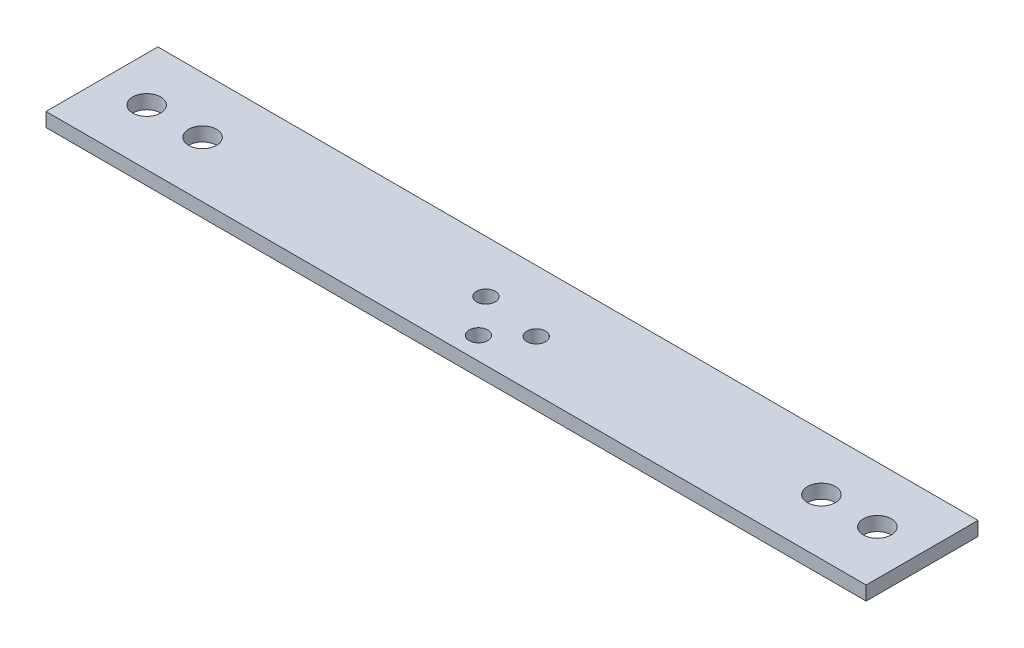
ISO-10303-21;
HEADER;
FILE_DESCRIPTION(('STEP AP214'),'2;1');
FILE_NAME('part.step','',(''),(''),'','','');
FILE_SCHEMA(('AUTOMOTIVE_DESIGN { 1 0 10303 214 1 1 1 1 }'));
ENDSEC;
DATA;
#1=APPLICATION_CONTEXT('core data for automotive mechanical design processes');
#2=APPLICATION_PROTOCOL_DEFINITION('international standard','automotive_design',2000,#1);
#3=PRODUCT_CONTEXT('',#1,'mechanical');
#4=PRODUCT('Part','Part','',(#3));
#5=PRODUCT_RELATED_PRODUCT_CATEGORY('part','',(#4));
#6=PRODUCT_DEFINITION_FORMATION('','',#4);
#7=PRODUCT_DEFINITION_CONTEXT('part definition',#1,'design');
#8=PRODUCT_DEFINITION('design','',#6,#7);
#9=PRODUCT_DEFINITION_SHAPE('','',#8);
#10=(LENGTH_UNIT() NAMED_UNIT(*) SI_UNIT(.MILLI.,.METRE.));
#11=(NAMED_UNIT(*) PLANE_ANGLE_UNIT() SI_UNIT($,.RADIAN.));
#12=(NAMED_UNIT(*) SI_UNIT($,.STERADIAN.) SOLID_ANGLE_UNIT());
#13=UNCERTAINTY_MEASURE_WITH_UNIT(LENGTH_MEASURE(1.E-05),#10,'distance_accuracy_value','');
#14=(GEOMETRIC_REPRESENTATION_CONTEXT(3) GLOBAL_UNCERTAINTY_ASSIGNED_CONTEXT((#13)) GLOBAL_UNIT_ASSIGNED_CONTEXT((#10,
#11,#12)) REPRESENTATION_CONTEXT('',''));
#15=CARTESIAN_POINT('',(0.,0.,0.));
#16=DIRECTION('',(0.,0.,1.));
#17=DIRECTION('',(1.,0.,0.));
#18=AXIS2_PLACEMENT_3D('',#15,#16,#17);
#19=CARTESIAN_POINT('',(0.,4.7625,0.));
#20=DIRECTION('',(0.,-1.,0.));
#21=DIRECTION('',(0.,0.,-1.));
#22=AXIS2_PLACEMENT_3D('',#19,#20,#21);
#23=PLANE('',#22);
#24=DIRECTION('',(0.,0.,-1.));
#25=VECTOR('',#24,1.);
#26=CARTESIAN_POINT('',(139.7,4.7625,19.05));
#27=LINE('',#26,#25);
#28=CARTESIAN_POINT('',(139.7,4.7625,19.05));
#29=VERTEX_POINT('',#28);
#30=CARTESIAN_POINT('',(139.7,4.7625,-19.05));
#31=VERTEX_POINT('',#30);
#32=EDGE_CURVE('E96',#29,#31,#27,.T.);
#33=ORIENTED_EDGE('',*,*,#32,.T.);
#34=DIRECTION('',(-1.,0.,0.));
#35=VECTOR('',#34,1.);
#36=CARTESIAN_POINT('',(-139.7,4.7625,-19.05));
#37=LINE('',#36,#35);
#38=CARTESIAN_POINT('',(-139.7,4.7625,-19.05));
#39=VERTEX_POINT('',#38);
#40=EDGE_CURVE('E91',#31,#39,#37,.T.);
#41=ORIENTED_EDGE('',*,*,#40,.T.);
#42=DIRECTION('',(0.,0.,1.));
#43=VECTOR('',#42,1.);
#44=CARTESIAN_POINT('',(-139.7,4.7625,19.05));
#45=LINE('',#44,#43);
#46=CARTESIAN_POINT('',(-139.7,4.7625,19.05));
#47=VERTEX_POINT('',#46);
#48=EDGE_CURVE('E94',#39,#47,#45,.T.);
#49=ORIENTED_EDGE('',*,*,#48,.T.);
#50=DIRECTION('',(1.,0.,0.));
#51=VECTOR('',#50,1.);
#52=CARTESIAN_POINT('',(-139.7,4.7625,19.05));
#53=LINE('',#52,#51);
#54=EDGE_CURVE('E61',#47,#29,#53,.T.);
#55=ORIENTED_EDGE('',*,*,#54,.T.);
#56=EDGE_LOOP('',(#33,#41,#49,#55));
#57=FACE_BOUND('',#56,.T.);
#58=CARTESIAN_POINT('',(-124.46,4.7625,0.));
#59=DIRECTION('',(0.,1.,0.));
#60=DIRECTION('',(0.,0.,1.));
#61=AXIS2_PLACEMENT_3D('',#58,#59,#60);
#62=CIRCLE('',#61,4.7625);
#63=CARTESIAN_POINT('',(-124.46,4.7625,-4.7625));
#64=VERTEX_POINT('',#63);
#65=EDGE_CURVE('E116',#64,#64,#62,.T.);
#66=ORIENTED_EDGE('',*,*,#65,.F.);
#67=EDGE_LOOP('',(#66));
#68=FACE_BOUND('',#67,.T.);
#69=CARTESIAN_POINT('',(-105.41,4.7625,0.));
#70=DIRECTION('',(0.,1.,0.));
#71=DIRECTION('',(0.,0.,1.));
#72=AXIS2_PLACEMENT_3D('',#69,#70,#71);
#73=CIRCLE('',#72,4.7625);
#74=CARTESIAN_POINT('',(-105.41,4.7625,-4.7625));
#75=VERTEX_POINT('',#74);
#76=EDGE_CURVE('E138',#75,#75,#73,.T.);
#77=ORIENTED_EDGE('',*,*,#76,.F.);
#78=EDGE_LOOP('',(#77));
#79=FACE_BOUND('',#78,.T.);
#80=CARTESIAN_POINT('',(124.46,4.7625,0.));
#81=DIRECTION('',(0.,1.,0.));
#82=DIRECTION('',(0.,0.,-1.));
#83=AXIS2_PLACEMENT_3D('',#80,#81,#82);
#84=CIRCLE('',#83,4.76250000000001);
#85=CARTESIAN_POINT('',(124.46,4.7625,-4.76250000000004));
#86=VERTEX_POINT('',#85);
#87=EDGE_CURVE('E146',#86,#86,#84,.T.);
#88=ORIENTED_EDGE('',*,*,#87,.F.);
#89=EDGE_LOOP('',(#88));
#90=FACE_BOUND('',#89,.T.);
#91=CARTESIAN_POINT('',(105.41,4.7625,0.));
#92=DIRECTION('',(0.,1.,0.));
#93=DIRECTION('',(0.,0.,-1.));
#94=AXIS2_PLACEMENT_3D('',#91,#92,#93);
#95=CIRCLE('',#94,4.7625);
#96=CARTESIAN_POINT('',(105.41,4.7625,-4.76250000000002));
#97=VERTEX_POINT('',#96);
#98=EDGE_CURVE('E154',#97,#97,#95,.T.);
#99=ORIENTED_EDGE('',*,*,#98,.F.);
#100=EDGE_LOOP('',(#99));
#101=FACE_BOUND('',#100,.T.);
#102=CARTESIAN_POINT('',(0.,4.7625,11.43));
#103=DIRECTION('',(0.,1.,0.));
#104=DIRECTION('',(0.,0.,1.));
#105=AXIS2_PLACEMENT_3D('',#102,#103,#104);
#106=CIRCLE('',#105,3.175);
#107=CARTESIAN_POINT('',(0.,4.7625,8.255));
#108=VERTEX_POINT('',#107);
#109=EDGE_CURVE('E162',#108,#108,#106,.T.);
#110=ORIENTED_EDGE('',*,*,#109,.F.);
#111=EDGE_LOOP('',(#110));
#112=FACE_BOUND('',#111,.T.);
#113=CARTESIAN_POINT('',(-10.16,4.7625,-1.27));
#114=DIRECTION('',(0.,1.,0.));
#115=DIRECTION('',(0.,0.,1.));
#116=AXIS2_PLACEMENT_3D('',#113,#114,#115);
#117=CIRCLE('',#116,3.175);
#118=CARTESIAN_POINT('',(-10.16,4.7625,-4.445));
#119=VERTEX_POINT('',#118);
#120=EDGE_CURVE('E170',#119,#119,#117,.T.);
#121=ORIENTED_EDGE('',*,*,#120,.F.);
#122=EDGE_LOOP('',(#121));
#123=FACE_BOUND('',#122,.T.);
#124=CARTESIAN_POINT('',(10.16,4.7625,1.905));
#125=DIRECTION('',(0.,1.,0.));
#126=DIRECTION('',(0.,0.,1.));
#127=AXIS2_PLACEMENT_3D('',#124,#125,#126);
#128=CIRCLE('',#127,3.175);
#129=CARTESIAN_POINT('',(10.16,4.7625,-1.27));
#130=VERTEX_POINT('',#129);
#131=EDGE_CURVE('E178',#130,#130,#128,.T.);
#132=ORIENTED_EDGE('',*,*,#131,.F.);
#133=EDGE_LOOP('',(#132));
#134=FACE_BOUND('',#133,.T.);
#135=ADVANCED_FACE('F43',(#57,#68,#79,#90,#101,#112,#123,#134),#23,.F.);
#136=CARTESIAN_POINT('',(0.,0.,0.));
#137=DIRECTION('',(0.,-1.,0.));
#138=DIRECTION('',(0.,0.,-1.));
#139=AXIS2_PLACEMENT_3D('',#136,#137,#138);
#140=PLANE('',#139);
#141=CARTESIAN_POINT('',(-10.16,0.,-1.27));
#142=DIRECTION('',(0.,1.,0.));
#143=DIRECTION('',(0.,0.,1.));
#144=AXIS2_PLACEMENT_3D('',#141,#142,#143);
#145=CIRCLE('',#144,3.175);
#146=CARTESIAN_POINT('',(-10.16,0.,-4.445));
#147=VERTEX_POINT('',#146);
#148=EDGE_CURVE('E174',#147,#147,#145,.T.);
#149=ORIENTED_EDGE('',*,*,#148,.T.);
#150=EDGE_LOOP('',(#149));
#151=FACE_BOUND('',#150,.T.);
#152=CARTESIAN_POINT('',(105.41,0.,0.));
#153=DIRECTION('',(0.,1.,0.));
#154=DIRECTION('',(0.,0.,-1.));
#155=AXIS2_PLACEMENT_3D('',#152,#153,#154);
#156=CIRCLE('',#155,4.7625);
#157=CARTESIAN_POINT('',(105.41,0.,-4.76250000000002));
#158=VERTEX_POINT('',#157);
#159=EDGE_CURVE('E158',#158,#158,#156,.T.);
#160=ORIENTED_EDGE('',*,*,#159,.T.);
#161=EDGE_LOOP('',(#160));
#162=FACE_BOUND('',#161,.T.);
#163=CARTESIAN_POINT('',(-105.41,0.,0.));
#164=DIRECTION('',(0.,1.,0.));
#165=DIRECTION('',(0.,0.,1.));
#166=AXIS2_PLACEMENT_3D('',#163,#164,#165);
#167=CIRCLE('',#166,4.7625);
#168=CARTESIAN_POINT('',(-105.41,0.,-4.7625));
#169=VERTEX_POINT('',#168);
#170=EDGE_CURVE('E142',#169,#169,#167,.T.);
#171=ORIENTED_EDGE('',*,*,#170,.T.);
#172=EDGE_LOOP('',(#171));
#173=FACE_BOUND('',#172,.T.);
#174=DIRECTION('',(0.,0.,-1.));
#175=VECTOR('',#174,1.);
#176=CARTESIAN_POINT('',(139.7,0.,19.05));
#177=LINE('',#176,#175);
#178=CARTESIAN_POINT('',(139.7,0.,19.05));
#179=VERTEX_POINT('',#178);
#180=CARTESIAN_POINT('',(139.7,0.,-19.05));
#181=VERTEX_POINT('',#180);
#182=EDGE_CURVE('E112',#179,#181,#177,.T.);
#183=ORIENTED_EDGE('',*,*,#182,.F.);
#184=DIRECTION('',(1.,0.,0.));
#185=VECTOR('',#184,1.);
#186=CARTESIAN_POINT('',(-139.7,0.,19.05));
#187=LINE('',#186,#185);
#188=CARTESIAN_POINT('',(-139.7,0.,19.05));
#189=VERTEX_POINT('',#188);
#190=EDGE_CURVE('E84',#189,#179,#187,.T.);
#191=ORIENTED_EDGE('',*,*,#190,.F.);
#192=DIRECTION('',(0.,0.,1.));
#193=VECTOR('',#192,1.);
#194=CARTESIAN_POINT('',(-139.7,0.,19.05));
#195=LINE('',#194,#193);
#196=CARTESIAN_POINT('',(-139.7,0.,-19.05));
#197=VERTEX_POINT('',#196);
#198=EDGE_CURVE('E78',#197,#189,#195,.T.);
#199=ORIENTED_EDGE('',*,*,#198,.F.);
#200=DIRECTION('',(-1.,0.,0.));
#201=VECTOR('',#200,1.);
#202=CARTESIAN_POINT('',(-139.7,0.,-19.05));
#203=LINE('',#202,#201);
#204=EDGE_CURVE('E101',#181,#197,#203,.T.);
#205=ORIENTED_EDGE('',*,*,#204,.F.);
#206=EDGE_LOOP('',(#183,#191,#199,#205));
#207=FACE_BOUND('',#206,.T.);
#208=CARTESIAN_POINT('',(-124.46,0.,0.));
#209=DIRECTION('',(0.,1.,0.));
#210=DIRECTION('',(0.,0.,1.));
#211=AXIS2_PLACEMENT_3D('',#208,#209,#210);
#212=CIRCLE('',#211,4.7625);
#213=CARTESIAN_POINT('',(-124.46,0.,-4.7625));
#214=VERTEX_POINT('',#213);
#215=EDGE_CURVE('E134',#214,#214,#212,.T.);
#216=ORIENTED_EDGE('',*,*,#215,.T.);
#217=EDGE_LOOP('',(#216));
#218=FACE_BOUND('',#217,.T.);
#219=CARTESIAN_POINT('',(124.46,0.,0.));
#220=DIRECTION('',(0.,1.,0.));
#221=DIRECTION('',(0.,0.,-1.));
#222=AXIS2_PLACEMENT_3D('',#219,#220,#221);
#223=CIRCLE('',#222,4.76250000000001);
#224=CARTESIAN_POINT('',(124.46,0.,-4.76250000000004));
#225=VERTEX_POINT('',#224);
#226=EDGE_CURVE('E150',#225,#225,#223,.T.);
#227=ORIENTED_EDGE('',*,*,#226,.T.);
#228=EDGE_LOOP('',(#227));
#229=FACE_BOUND('',#228,.T.);
#230=CARTESIAN_POINT('',(0.,0.,11.43));
#231=DIRECTION('',(0.,1.,0.));
#232=DIRECTION('',(0.,0.,1.));
#233=AXIS2_PLACEMENT_3D('',#230,#231,#232);
#234=CIRCLE('',#233,3.175);
#235=CARTESIAN_POINT('',(0.,0.,8.255));
#236=VERTEX_POINT('',#235);
#237=EDGE_CURVE('E166',#236,#236,#234,.T.);
#238=ORIENTED_EDGE('',*,*,#237,.T.);
#239=EDGE_LOOP('',(#238));
#240=FACE_BOUND('',#239,.T.);
#241=CARTESIAN_POINT('',(10.16,0.,1.905));
#242=DIRECTION('',(0.,1.,0.));
#243=DIRECTION('',(0.,0.,1.));
#244=AXIS2_PLACEMENT_3D('',#241,#242,#243);
#245=CIRCLE('',#244,3.175);
#246=CARTESIAN_POINT('',(10.16,0.,-1.27));
#247=VERTEX_POINT('',#246);
#248=EDGE_CURVE('E182',#247,#247,#245,.T.);
#249=ORIENTED_EDGE('',*,*,#248,.T.);
#250=EDGE_LOOP('',(#249));
#251=FACE_BOUND('',#250,.T.);
#252=ADVANCED_FACE('F129',(#151,#162,#173,#207,#218,#229,#240,#251),#140,.T.);
#253=CARTESIAN_POINT('',(139.7,4.7625,19.05));
#254=DIRECTION('',(-1.,0.,0.));
#255=DIRECTION('',(0.,0.,1.));
#256=AXIS2_PLACEMENT_3D('',#253,#254,#255);
#257=PLANE('',#256);
#258=ORIENTED_EDGE('',*,*,#182,.T.);
#259=DIRECTION('',(0.,-1.,0.));
#260=VECTOR('',#259,1.);
#261=CARTESIAN_POINT('',(139.7,4.7625,-19.05));
#262=LINE('',#261,#260);
#263=EDGE_CURVE('E11',#31,#181,#262,.T.);
#264=ORIENTED_EDGE('',*,*,#263,.F.);
#265=ORIENTED_EDGE('',*,*,#32,.F.);
#266=DIRECTION('',(0.,-1.,0.));
#267=VECTOR('',#266,1.);
#268=CARTESIAN_POINT('',(139.7,4.7625,19.05));
#269=LINE('',#268,#267);
#270=EDGE_CURVE('E108',#29,#179,#269,.T.);
#271=ORIENTED_EDGE('',*,*,#270,.T.);
#272=EDGE_LOOP('',(#258,#264,#265,#271));
#273=FACE_BOUND('',#272,.T.);
#274=ADVANCED_FACE('F45',(#273),#257,.F.);
#275=CARTESIAN_POINT('',(-139.7,4.7625,-19.05));
#276=DIRECTION('',(0.,0.,1.));
#277=DIRECTION('',(1.,0.,0.));
#278=AXIS2_PLACEMENT_3D('',#275,#276,#277);
#279=PLANE('',#278);
#280=ORIENTED_EDGE('',*,*,#204,.T.);
#281=DIRECTION('',(0.,-1.,0.));
#282=VECTOR('',#281,1.);
#283=CARTESIAN_POINT('',(-139.7,4.7625,-19.05));
#284=LINE('',#283,#282);
#285=EDGE_CURVE('E53',#39,#197,#284,.T.);
#286=ORIENTED_EDGE('',*,*,#285,.F.);
#287=ORIENTED_EDGE('',*,*,#40,.F.);
#288=ORIENTED_EDGE('',*,*,#263,.T.);
#289=EDGE_LOOP('',(#280,#286,#287,#288));
#290=FACE_BOUND('',#289,.T.);
#291=ADVANCED_FACE('F100',(#290),#279,.F.);
#292=CARTESIAN_POINT('',(-139.7,4.7625,19.05));
#293=DIRECTION('',(1.,0.,0.));
#294=DIRECTION('',(0.,0.,-1.));
#295=AXIS2_PLACEMENT_3D('',#292,#293,#294);
#296=PLANE('',#295);
#297=ORIENTED_EDGE('',*,*,#198,.T.);
#298=DIRECTION('',(0.,-1.,0.));
#299=VECTOR('',#298,1.);
#300=CARTESIAN_POINT('',(-139.7,4.7625,19.05));
#301=LINE('',#300,#299);
#302=EDGE_CURVE('E103',#47,#189,#301,.T.);
#303=ORIENTED_EDGE('',*,*,#302,.F.);
#304=ORIENTED_EDGE('',*,*,#48,.F.);
#305=ORIENTED_EDGE('',*,*,#285,.T.);
#306=EDGE_LOOP('',(#297,#303,#304,#305));
#307=FACE_BOUND('',#306,.T.);
#308=ADVANCED_FACE('F104',(#307),#296,.F.);
#309=CARTESIAN_POINT('',(-139.7,4.7625,19.05));
#310=DIRECTION('',(0.,0.,-1.));
#311=DIRECTION('',(-1.,0.,0.));
#312=AXIS2_PLACEMENT_3D('',#309,#310,#311);
#313=PLANE('',#312);
#314=ORIENTED_EDGE('',*,*,#190,.T.);
#315=ORIENTED_EDGE('',*,*,#270,.F.);
#316=ORIENTED_EDGE('',*,*,#54,.F.);
#317=ORIENTED_EDGE('',*,*,#302,.T.);
#318=EDGE_LOOP('',(#314,#315,#316,#317));
#319=FACE_BOUND('',#318,.T.);
#320=ADVANCED_FACE('F126',(#319),#313,.F.);
#321=CARTESIAN_POINT('',(-124.46,4.7625,0.));
#322=DIRECTION('',(0.,-1.,0.));
#323=DIRECTION('',(0.,0.,-1.));
#324=AXIS2_PLACEMENT_3D('',#321,#322,#323);
#325=CYLINDRICAL_SURFACE('',#324,4.7625);
#326=CARTESIAN_POINT('',(-124.46,4.7625,-4.7625));
#327=CARTESIAN_POINT('',(-124.46,4.712890625,-4.7625));
#328=CARTESIAN_POINT('',(-124.46,4.66328125,-4.7625));
#329=CARTESIAN_POINT('',(-124.46,4.5640625,-4.7625));
#330=CARTESIAN_POINT('',(-124.46,4.514453125,-4.7625));
#331=CARTESIAN_POINT('',(-124.46,4.415234375,-4.7625));
#332=CARTESIAN_POINT('',(-124.46,4.365625,-4.7625));
#333=CARTESIAN_POINT('',(-124.46,4.26640625,-4.7625));
#334=CARTESIAN_POINT('',(-124.46,4.216796875,-4.7625));
#335=CARTESIAN_POINT('',(-124.46,4.117578125,-4.7625));
#336=CARTESIAN_POINT('',(-124.46,4.06796875,-4.7625));
#337=CARTESIAN_POINT('',(-124.46,3.96875,-4.7625));
#338=CARTESIAN_POINT('',(-124.46,3.919140625,-4.7625));
#339=CARTESIAN_POINT('',(-124.46,3.819921875,-4.7625));
#340=CARTESIAN_POINT('',(-124.46,3.7703125,-4.7625));
#341=CARTESIAN_POINT('',(-124.46,3.67109375,-4.7625));
#342=CARTESIAN_POINT('',(-124.46,3.621484375,-4.7625));
#343=CARTESIAN_POINT('',(-124.46,3.522265625,-4.7625));
#344=CARTESIAN_POINT('',(-124.46,3.47265625,-4.7625));
#345=CARTESIAN_POINT('',(-124.46,3.3734375,-4.7625));
#346=CARTESIAN_POINT('',(-124.46,3.323828125,-4.7625));
#347=CARTESIAN_POINT('',(-124.46,3.224609375,-4.7625));
#348=CARTESIAN_POINT('',(-124.46,3.175,-4.7625));
#349=CARTESIAN_POINT('',(-124.46,3.07578125,-4.7625));
#350=CARTESIAN_POINT('',(-124.46,3.026171875,-4.7625));
#351=CARTESIAN_POINT('',(-124.46,2.926953125,-4.7625));
#352=CARTESIAN_POINT('',(-124.46,2.87734375,-4.7625));
#353=CARTESIAN_POINT('',(-124.46,2.778125,-4.7625));
#354=CARTESIAN_POINT('',(-124.46,2.728515625,-4.7625));
#355=CARTESIAN_POINT('',(-124.46,2.629296875,-4.7625));
#356=CARTESIAN_POINT('',(-124.46,2.5796875,-4.7625));
#357=CARTESIAN_POINT('',(-124.46,2.48046875,-4.7625));
#358=CARTESIAN_POINT('',(-124.46,2.430859375,-4.7625));
#359=CARTESIAN_POINT('',(-124.46,2.331640625,-4.7625));
#360=CARTESIAN_POINT('',(-124.46,2.28203125,-4.7625));
#361=CARTESIAN_POINT('',(-124.46,2.1828125,-4.7625));
#362=CARTESIAN_POINT('',(-124.46,2.133203125,-4.7625));
#363=CARTESIAN_POINT('',(-124.46,2.033984375,-4.7625));
#364=CARTESIAN_POINT('',(-124.46,1.984375,-4.7625));
#365=CARTESIAN_POINT('',(-124.46,1.88515625,-4.7625));
#366=CARTESIAN_POINT('',(-124.46,1.835546875,-4.7625));
#367=CARTESIAN_POINT('',(-124.46,1.736328125,-4.7625));
#368=CARTESIAN_POINT('',(-124.46,1.68671875,-4.7625));
#369=CARTESIAN_POINT('',(-124.46,1.5875,-4.7625));
#370=CARTESIAN_POINT('',(-124.46,1.537890625,-4.7625));
#371=CARTESIAN_POINT('',(-124.46,1.438671875,-4.7625));
#372=CARTESIAN_POINT('',(-124.46,1.3890625,-4.7625));
#373=CARTESIAN_POINT('',(-124.46,1.28984375,-4.7625));
#374=CARTESIAN_POINT('',(-124.46,1.240234375,-4.7625));
#375=CARTESIAN_POINT('',(-124.46,1.141015625,-4.7625));
#376=CARTESIAN_POINT('',(-124.46,1.09140625,-4.7625));
#377=CARTESIAN_POINT('',(-124.46,0.992187499999999,-4.7625));
#378=CARTESIAN_POINT('',(-124.46,0.942578124999999,-4.7625));
#379=CARTESIAN_POINT('',(-124.46,0.843359375,-4.7625));
#380=CARTESIAN_POINT('',(-124.46,0.79375,-4.7625));
#381=CARTESIAN_POINT('',(-124.46,0.69453125,-4.7625));
#382=CARTESIAN_POINT('',(-124.46,0.644921875,-4.7625));
#383=CARTESIAN_POINT('',(-124.46,0.545703125,-4.7625));
#384=CARTESIAN_POINT('',(-124.46,0.49609375,-4.7625));
#385=CARTESIAN_POINT('',(-124.46,0.396875,-4.7625));
#386=CARTESIAN_POINT('',(-124.46,0.347265625,-4.7625));
#387=CARTESIAN_POINT('',(-124.46,0.248046875,-4.7625));
#388=CARTESIAN_POINT('',(-124.46,0.1984375,-4.7625));
#389=CARTESIAN_POINT('',(-124.46,0.09921875,-4.7625));
#390=CARTESIAN_POINT('',(-124.46,0.049609375,-4.7625));
#391=CARTESIAN_POINT('',(-124.46,0.,-4.7625));
#392=B_SPLINE_CURVE_WITH_KNOTS('',3,(#326,#327,#328,#329,#330,#331,#332,#333,#334,#335,#336,
#337,#338,#339,#340,#341,#342,#343,#344,#345,#346,#347,#348,#349,#350,#351,#352,#353,#354,#355,
#356,#357,#358,#359,#360,#361,#362,#363,#364,#365,#366,#367,#368,#369,#370,#371,#372,#373,#374,
#375,#376,#377,#378,#379,#380,#381,#382,#383,#384,#385,#386,#387,#388,#389,#390,#391),
.UNSPECIFIED.,.F.,.F.,(4,2,2,2,2,2,2,2,2,2,2,2,2,2,2,2,2,2,2,2,2,2,2,2,2,2,2,2,2,2,2,2,4),(0.,
0.148828125,0.29765625,0.446484375,0.5953125,0.744140625,0.892968750000001,1.041796875,1.190625,
1.339453125,1.48828125,1.637109375,1.7859375,1.934765625,2.08359375,2.232421875,2.38125,
2.530078125,2.67890625,2.827734375,2.9765625,3.125390625,3.27421875,3.423046875,3.571875,
3.720703125,3.86953125,4.018359375,4.1671875,4.316015625,4.46484375,4.613671875,4.7625),.UNSPECIFIED.);
#393=EDGE_CURVE('BSEAM201',#64,#214,#392,.T.);
#394=ORIENTED_EDGE('',*,*,#65,.T.);
#395=ORIENTED_EDGE('',*,*,#215,.F.);
#396=ORIENTED_EDGE('',*,*,#393,.T.);
#397=ORIENTED_EDGE('',*,*,#393,.F.);
#398=EDGE_LOOP('',(#394,#396,#395,#397));
#399=FACE_BOUND('',#398,.T.);
#400=ADVANCED_FACE('F201',(#399),#325,.F.);
#401=CARTESIAN_POINT('',(-105.41,4.7625,0.));
#402=DIRECTION('',(0.,-1.,0.));
#403=DIRECTION('',(0.,0.,-1.));
#404=AXIS2_PLACEMENT_3D('',#401,#402,#403);
#405=CYLINDRICAL_SURFACE('',#404,4.7625);
#406=CARTESIAN_POINT('',(-105.41,4.7625,-4.7625));
#407=CARTESIAN_POINT('',(-105.41,4.712890625,-4.7625));
#408=CARTESIAN_POINT('',(-105.41,4.66328125,-4.7625));
#409=CARTESIAN_POINT('',(-105.41,4.5640625,-4.7625));
#410=CARTESIAN_POINT('',(-105.41,4.514453125,-4.7625));
#411=CARTESIAN_POINT('',(-105.41,4.415234375,-4.7625));
#412=CARTESIAN_POINT('',(-105.41,4.365625,-4.7625));
#413=CARTESIAN_POINT('',(-105.41,4.26640625,-4.7625));
#414=CARTESIAN_POINT('',(-105.41,4.216796875,-4.7625));
#415=CARTESIAN_POINT('',(-105.41,4.117578125,-4.7625));
#416=CARTESIAN_POINT('',(-105.41,4.06796875,-4.7625));
#417=CARTESIAN_POINT('',(-105.41,3.96875,-4.7625));
#418=CARTESIAN_POINT('',(-105.41,3.919140625,-4.7625));
#419=CARTESIAN_POINT('',(-105.41,3.819921875,-4.7625));
#420=CARTESIAN_POINT('',(-105.41,3.7703125,-4.7625));
#421=CARTESIAN_POINT('',(-105.41,3.67109375,-4.7625));
#422=CARTESIAN_POINT('',(-105.41,3.621484375,-4.7625));
#423=CARTESIAN_POINT('',(-105.41,3.522265625,-4.7625));
#424=CARTESIAN_POINT('',(-105.41,3.47265625,-4.7625));
#425=CARTESIAN_POINT('',(-105.41,3.3734375,-4.7625));
#426=CARTESIAN_POINT('',(-105.41,3.323828125,-4.7625));
#427=CARTESIAN_POINT('',(-105.41,3.224609375,-4.7625));
#428=CARTESIAN_POINT('',(-105.41,3.175,-4.7625));
#429=CARTESIAN_POINT('',(-105.41,3.07578125,-4.7625));
#430=CARTESIAN_POINT('',(-105.41,3.026171875,-4.7625));
#431=CARTESIAN_POINT('',(-105.41,2.926953125,-4.7625));
#432=CARTESIAN_POINT('',(-105.41,2.87734375,-4.7625));
#433=CARTESIAN_POINT('',(-105.41,2.778125,-4.7625));
#434=CARTESIAN_POINT('',(-105.41,2.728515625,-4.7625));
#435=CARTESIAN_POINT('',(-105.41,2.629296875,-4.7625));
#436=CARTESIAN_POINT('',(-105.41,2.5796875,-4.7625));
#437=CARTESIAN_POINT('',(-105.41,2.48046875,-4.7625));
#438=CARTESIAN_POINT('',(-105.41,2.430859375,-4.7625));
#439=CARTESIAN_POINT('',(-105.41,2.331640625,-4.7625));
#440=CARTESIAN_POINT('',(-105.41,2.28203125,-4.7625));
#441=CARTESIAN_POINT('',(-105.41,2.1828125,-4.7625));
#442=CARTESIAN_POINT('',(-105.41,2.133203125,-4.7625));
#443=CARTESIAN_POINT('',(-105.41,2.033984375,-4.7625));
#444=CARTESIAN_POINT('',(-105.41,1.984375,-4.7625));
#445=CARTESIAN_POINT('',(-105.41,1.88515625,-4.7625));
#446=CARTESIAN_POINT('',(-105.41,1.835546875,-4.7625));
#447=CARTESIAN_POINT('',(-105.41,1.736328125,-4.7625));
#448=CARTESIAN_POINT('',(-105.41,1.68671875,-4.7625));
#449=CARTESIAN_POINT('',(-105.41,1.5875,-4.7625));
#450=CARTESIAN_POINT('',(-105.41,1.537890625,-4.7625));
#451=CARTESIAN_POINT('',(-105.41,1.438671875,-4.7625));
#452=CARTESIAN_POINT('',(-105.41,1.3890625,-4.7625));
#453=CARTESIAN_POINT('',(-105.41,1.28984375,-4.7625));
#454=CARTESIAN_POINT('',(-105.41,1.240234375,-4.7625));
#455=CARTESIAN_POINT('',(-105.41,1.141015625,-4.7625));
#456=CARTESIAN_POINT('',(-105.41,1.09140625,-4.7625));
#457=CARTESIAN_POINT('',(-105.41,0.992187499999999,-4.7625));
#458=CARTESIAN_POINT('',(-105.41,0.942578124999999,-4.7625));
#459=CARTESIAN_POINT('',(-105.41,0.843359375,-4.7625));
#460=CARTESIAN_POINT('',(-105.41,0.79375,-4.7625));
#461=CARTESIAN_POINT('',(-105.41,0.69453125,-4.7625));
#462=CARTESIAN_POINT('',(-105.41,0.644921875,-4.7625));
#463=CARTESIAN_POINT('',(-105.41,0.545703125,-4.7625));
#464=CARTESIAN_POINT('',(-105.41,0.49609375,-4.7625));
#465=CARTESIAN_POINT('',(-105.41,0.396875,-4.7625));
#466=CARTESIAN_POINT('',(-105.41,0.347265625,-4.7625));
#467=CARTESIAN_POINT('',(-105.41,0.248046875,-4.7625));
#468=CARTESIAN_POINT('',(-105.41,0.1984375,-4.7625));
#469=CARTESIAN_POINT('',(-105.41,0.09921875,-4.7625));
#470=CARTESIAN_POINT('',(-105.41,0.049609375,-4.7625));
#471=CARTESIAN_POINT('',(-105.41,0.,-4.7625));
#472=B_SPLINE_CURVE_WITH_KNOTS('',3,(#406,#407,#408,#409,#410,#411,#412,#413,#414,#415,#416,
#417,#418,#419,#420,#421,#422,#423,#424,#425,#426,#427,#428,#429,#430,#431,#432,#433,#434,#435,
#436,#437,#438,#439,#440,#441,#442,#443,#444,#445,#446,#447,#448,#449,#450,#451,#452,#453,#454,
#455,#456,#457,#458,#459,#460,#461,#462,#463,#464,#465,#466,#467,#468,#469,#470,#471),
.UNSPECIFIED.,.F.,.F.,(4,2,2,2,2,2,2,2,2,2,2,2,2,2,2,2,2,2,2,2,2,2,2,2,2,2,2,2,2,2,2,2,4),(0.,
0.148828125,0.29765625,0.446484375,0.5953125,0.744140625,0.892968750000001,1.041796875,1.190625,
1.339453125,1.48828125,1.637109375,1.7859375,1.934765625,2.08359375,2.232421875,2.38125,
2.530078125,2.67890625,2.827734375,2.9765625,3.125390625,3.27421875,3.423046875,3.571875,
3.720703125,3.86953125,4.018359375,4.1671875,4.316015625,4.46484375,4.613671875,4.7625),.UNSPECIFIED.);
#473=EDGE_CURVE('BSEAM255',#75,#169,#472,.T.);
#474=ORIENTED_EDGE('',*,*,#76,.T.);
#475=ORIENTED_EDGE('',*,*,#170,.F.);
#476=ORIENTED_EDGE('',*,*,#473,.T.);
#477=ORIENTED_EDGE('',*,*,#473,.F.);
#478=EDGE_LOOP('',(#474,#476,#475,#477));
#479=FACE_BOUND('',#478,.T.);
#480=ADVANCED_FACE('F255',(#479),#405,.F.);
#481=CARTESIAN_POINT('',(124.46,4.7625,0.));
#482=DIRECTION('',(0.,-1.,0.));
#483=DIRECTION('',(0.,0.,-1.));
#484=AXIS2_PLACEMENT_3D('',#481,#482,#483);
#485=CYLINDRICAL_SURFACE('',#484,4.76250000000001);
#486=CARTESIAN_POINT('',(124.46,4.7625,-4.76250000000004));
#487=CARTESIAN_POINT('',(124.46,4.712890625,-4.76250000000004));
#488=CARTESIAN_POINT('',(124.46,4.66328125,-4.76250000000004));
#489=CARTESIAN_POINT('',(124.46,4.5640625,-4.76250000000004));
#490=CARTESIAN_POINT('',(124.46,4.514453125,-4.76250000000004));
#491=CARTESIAN_POINT('',(124.46,4.415234375,-4.76250000000004));
#492=CARTESIAN_POINT('',(124.46,4.365625,-4.76250000000004));
#493=CARTESIAN_POINT('',(124.46,4.26640625,-4.76250000000004));
#494=CARTESIAN_POINT('',(124.46,4.216796875,-4.76250000000004));
#495=CARTESIAN_POINT('',(124.46,4.117578125,-4.76250000000004));
#496=CARTESIAN_POINT('',(124.46,4.06796875,-4.76250000000004));
#497=CARTESIAN_POINT('',(124.46,3.96875,-4.76250000000004));
#498=CARTESIAN_POINT('',(124.46,3.919140625,-4.76250000000004));
#499=CARTESIAN_POINT('',(124.46,3.819921875,-4.76250000000004));
#500=CARTESIAN_POINT('',(124.46,3.7703125,-4.76250000000004));
#501=CARTESIAN_POINT('',(124.46,3.67109375,-4.76250000000004));
#502=CARTESIAN_POINT('',(124.46,3.621484375,-4.76250000000004));
#503=CARTESIAN_POINT('',(124.46,3.522265625,-4.76250000000004));
#504=CARTESIAN_POINT('',(124.46,3.47265625,-4.76250000000004));
#505=CARTESIAN_POINT('',(124.46,3.3734375,-4.76250000000004));
#506=CARTESIAN_POINT('',(124.46,3.323828125,-4.76250000000004));
#507=CARTESIAN_POINT('',(124.46,3.224609375,-4.76250000000004));
#508=CARTESIAN_POINT('',(124.46,3.175,-4.76250000000004));
#509=CARTESIAN_POINT('',(124.46,3.07578125,-4.76250000000004));
#510=CARTESIAN_POINT('',(124.46,3.026171875,-4.76250000000004));
#511=CARTESIAN_POINT('',(124.46,2.926953125,-4.76250000000004));
#512=CARTESIAN_POINT('',(124.46,2.87734375,-4.76250000000004));
#513=CARTESIAN_POINT('',(124.46,2.778125,-4.76250000000004));
#514=CARTESIAN_POINT('',(124.46,2.728515625,-4.76250000000004));
#515=CARTESIAN_POINT('',(124.46,2.629296875,-4.76250000000004));
#516=CARTESIAN_POINT('',(124.46,2.5796875,-4.76250000000004));
#517=CARTESIAN_POINT('',(124.46,2.48046875,-4.76250000000004));
#518=CARTESIAN_POINT('',(124.46,2.430859375,-4.76250000000004));
#519=CARTESIAN_POINT('',(124.46,2.331640625,-4.76250000000004));
#520=CARTESIAN_POINT('',(124.46,2.28203125,-4.76250000000004));
#521=CARTESIAN_POINT('',(124.46,2.1828125,-4.76250000000004));
#522=CARTESIAN_POINT('',(124.46,2.133203125,-4.76250000000004));
#523=CARTESIAN_POINT('',(124.46,2.033984375,-4.76250000000004));
#524=CARTESIAN_POINT('',(124.46,1.984375,-4.76250000000004));
#525=CARTESIAN_POINT('',(124.46,1.88515625,-4.76250000000004));
#526=CARTESIAN_POINT('',(124.46,1.835546875,-4.76250000000004));
#527=CARTESIAN_POINT('',(124.46,1.736328125,-4.76250000000004));
#528=CARTESIAN_POINT('',(124.46,1.68671875,-4.76250000000004));
#529=CARTESIAN_POINT('',(124.46,1.5875,-4.76250000000004));
#530=CARTESIAN_POINT('',(124.46,1.537890625,-4.76250000000004));
#531=CARTESIAN_POINT('',(124.46,1.438671875,-4.76250000000004));
#532=CARTESIAN_POINT('',(124.46,1.3890625,-4.76250000000004));
#533=CARTESIAN_POINT('',(124.46,1.28984375,-4.76250000000004));
#534=CARTESIAN_POINT('',(124.46,1.240234375,-4.76250000000004));
#535=CARTESIAN_POINT('',(124.46,1.141015625,-4.76250000000004));
#536=CARTESIAN_POINT('',(124.46,1.09140625,-4.76250000000004));
#537=CARTESIAN_POINT('',(124.46,0.992187499999999,-4.76250000000004));
#538=CARTESIAN_POINT('',(124.46,0.942578124999999,-4.76250000000004));
#539=CARTESIAN_POINT('',(124.46,0.843359375,-4.76250000000004));
#540=CARTESIAN_POINT('',(124.46,0.79375,-4.76250000000004));
#541=CARTESIAN_POINT('',(124.46,0.69453125,-4.76250000000004));
#542=CARTESIAN_POINT('',(124.46,0.644921875,-4.76250000000004));
#543=CARTESIAN_POINT('',(124.46,0.545703125,-4.76250000000004));
#544=CARTESIAN_POINT('',(124.46,0.49609375,-4.76250000000004));
#545=CARTESIAN_POINT('',(124.46,0.396875,-4.76250000000004));
#546=CARTESIAN_POINT('',(124.46,0.347265625,-4.76250000000004));
#547=CARTESIAN_POINT('',(124.46,0.248046875,-4.76250000000004));
#548=CARTESIAN_POINT('',(124.46,0.1984375,-4.76250000000004));
#549=CARTESIAN_POINT('',(124.46,0.09921875,-4.76250000000004));
#550=CARTESIAN_POINT('',(124.46,0.049609375,-4.76250000000004));
#551=CARTESIAN_POINT('',(124.46,0.,-4.76250000000004));
#552=B_SPLINE_CURVE_WITH_KNOTS('',3,(#486,#487,#488,#489,#490,#491,#492,#493,#494,#495,#496,
#497,#498,#499,#500,#501,#502,#503,#504,#505,#506,#507,#508,#509,#510,#511,#512,#513,#514,#515,
#516,#517,#518,#519,#520,#521,#522,#523,#524,#525,#526,#527,#528,#529,#530,#531,#532,#533,#534,
#535,#536,#537,#538,#539,#540,#541,#542,#543,#544,#545,#546,#547,#548,#549,#550,#551),
.UNSPECIFIED.,.F.,.F.,(4,2,2,2,2,2,2,2,2,2,2,2,2,2,2,2,2,2,2,2,2,2,2,2,2,2,2,2,2,2,2,2,4),(0.,
0.148828125,0.29765625,0.446484375,0.5953125,0.744140625,0.892968750000001,1.041796875,1.190625,
1.339453125,1.48828125,1.637109375,1.7859375,1.934765625,2.08359375,2.232421875,2.38125,
2.530078125,2.67890625,2.827734375,2.9765625,3.125390625,3.27421875,3.423046875,3.571875,
3.720703125,3.86953125,4.018359375,4.1671875,4.316015625,4.46484375,4.613671875,4.7625),.UNSPECIFIED.);
#553=EDGE_CURVE('BSEAM264',#86,#225,#552,.T.);
#554=ORIENTED_EDGE('',*,*,#87,.T.);
#555=ORIENTED_EDGE('',*,*,#226,.F.);
#556=ORIENTED_EDGE('',*,*,#553,.T.);
#557=ORIENTED_EDGE('',*,*,#553,.F.);
#558=EDGE_LOOP('',(#554,#556,#555,#557));
#559=FACE_BOUND('',#558,.T.);
#560=ADVANCED_FACE('F264',(#559),#485,.F.);
#561=CARTESIAN_POINT('',(105.41,4.7625,0.));
#562=DIRECTION('',(0.,-1.,0.));
#563=DIRECTION('',(0.,0.,-1.));
#564=AXIS2_PLACEMENT_3D('',#561,#562,#563);
#565=CYLINDRICAL_SURFACE('',#564,4.7625);
#566=CARTESIAN_POINT('',(105.41,4.7625,-4.76250000000002));
#567=CARTESIAN_POINT('',(105.41,4.712890625,-4.76250000000002));
#568=CARTESIAN_POINT('',(105.41,4.66328125,-4.76250000000002));
#569=CARTESIAN_POINT('',(105.41,4.5640625,-4.76250000000002));
#570=CARTESIAN_POINT('',(105.41,4.514453125,-4.76250000000002));
#571=CARTESIAN_POINT('',(105.41,4.415234375,-4.76250000000002));
#572=CARTESIAN_POINT('',(105.41,4.365625,-4.76250000000002));
#573=CARTESIAN_POINT('',(105.41,4.26640625,-4.76250000000002));
#574=CARTESIAN_POINT('',(105.41,4.216796875,-4.76250000000002));
#575=CARTESIAN_POINT('',(105.41,4.117578125,-4.76250000000002));
#576=CARTESIAN_POINT('',(105.41,4.06796875,-4.76250000000002));
#577=CARTESIAN_POINT('',(105.41,3.96875,-4.76250000000002));
#578=CARTESIAN_POINT('',(105.41,3.919140625,-4.76250000000002));
#579=CARTESIAN_POINT('',(105.41,3.819921875,-4.76250000000002));
#580=CARTESIAN_POINT('',(105.41,3.7703125,-4.76250000000002));
#581=CARTESIAN_POINT('',(105.41,3.67109375,-4.76250000000002));
#582=CARTESIAN_POINT('',(105.41,3.621484375,-4.76250000000002));
#583=CARTESIAN_POINT('',(105.41,3.522265625,-4.76250000000002));
#584=CARTESIAN_POINT('',(105.41,3.47265625,-4.76250000000002));
#585=CARTESIAN_POINT('',(105.41,3.3734375,-4.76250000000002));
#586=CARTESIAN_POINT('',(105.41,3.323828125,-4.76250000000002));
#587=CARTESIAN_POINT('',(105.41,3.224609375,-4.76250000000002));
#588=CARTESIAN_POINT('',(105.41,3.175,-4.76250000000002));
#589=CARTESIAN_POINT('',(105.41,3.07578125,-4.76250000000002));
#590=CARTESIAN_POINT('',(105.41,3.026171875,-4.76250000000002));
#591=CARTESIAN_POINT('',(105.41,2.926953125,-4.76250000000002));
#592=CARTESIAN_POINT('',(105.41,2.87734375,-4.76250000000002));
#593=CARTESIAN_POINT('',(105.41,2.778125,-4.76250000000002));
#594=CARTESIAN_POINT('',(105.41,2.728515625,-4.76250000000002));
#595=CARTESIAN_POINT('',(105.41,2.629296875,-4.76250000000002));
#596=CARTESIAN_POINT('',(105.41,2.5796875,-4.76250000000002));
#597=CARTESIAN_POINT('',(105.41,2.48046875,-4.76250000000002));
#598=CARTESIAN_POINT('',(105.41,2.430859375,-4.76250000000002));
#599=CARTESIAN_POINT('',(105.41,2.331640625,-4.76250000000002));
#600=CARTESIAN_POINT('',(105.41,2.28203125,-4.76250000000002));
#601=CARTESIAN_POINT('',(105.41,2.1828125,-4.76250000000002));
#602=CARTESIAN_POINT('',(105.41,2.133203125,-4.76250000000002));
#603=CARTESIAN_POINT('',(105.41,2.033984375,-4.76250000000002));
#604=CARTESIAN_POINT('',(105.41,1.984375,-4.76250000000002));
#605=CARTESIAN_POINT('',(105.41,1.88515625,-4.76250000000002));
#606=CARTESIAN_POINT('',(105.41,1.835546875,-4.76250000000002));
#607=CARTESIAN_POINT('',(105.41,1.736328125,-4.76250000000002));
#608=CARTESIAN_POINT('',(105.41,1.68671875,-4.76250000000002));
#609=CARTESIAN_POINT('',(105.41,1.5875,-4.76250000000002));
#610=CARTESIAN_POINT('',(105.41,1.537890625,-4.76250000000002));
#611=CARTESIAN_POINT('',(105.41,1.438671875,-4.76250000000002));
#612=CARTESIAN_POINT('',(105.41,1.3890625,-4.76250000000002));
#613=CARTESIAN_POINT('',(105.41,1.28984375,-4.76250000000002));
#614=CARTESIAN_POINT('',(105.41,1.240234375,-4.76250000000002));
#615=CARTESIAN_POINT('',(105.41,1.141015625,-4.76250000000002));
#616=CARTESIAN_POINT('',(105.41,1.09140625,-4.76250000000002));
#617=CARTESIAN_POINT('',(105.41,0.992187499999999,-4.76250000000002));
#618=CARTESIAN_POINT('',(105.41,0.942578124999999,-4.76250000000002));
#619=CARTESIAN_POINT('',(105.41,0.843359375,-4.76250000000002));
#620=CARTESIAN_POINT('',(105.41,0.79375,-4.76250000000002));
#621=CARTESIAN_POINT('',(105.41,0.69453125,-4.76250000000002));
#622=CARTESIAN_POINT('',(105.41,0.644921875,-4.76250000000002));
#623=CARTESIAN_POINT('',(105.41,0.545703125,-4.76250000000002));
#624=CARTESIAN_POINT('',(105.41,0.49609375,-4.76250000000002));
#625=CARTESIAN_POINT('',(105.41,0.396875,-4.76250000000002));
#626=CARTESIAN_POINT('',(105.41,0.347265625,-4.76250000000002));
#627=CARTESIAN_POINT('',(105.41,0.248046875,-4.76250000000002));
#628=CARTESIAN_POINT('',(105.41,0.1984375,-4.76250000000002));
#629=CARTESIAN_POINT('',(105.41,0.09921875,-4.76250000000002));
#630=CARTESIAN_POINT('',(105.41,0.049609375,-4.76250000000002));
#631=CARTESIAN_POINT('',(105.41,0.,-4.76250000000002));
#632=B_SPLINE_CURVE_WITH_KNOTS('',3,(#566,#567,#568,#569,#570,#571,#572,#573,#574,#575,#576,
#577,#578,#579,#580,#581,#582,#583,#584,#585,#586,#587,#588,#589,#590,#591,#592,#593,#594,#595,
#596,#597,#598,#599,#600,#601,#602,#603,#604,#605,#606,#607,#608,#609,#610,#611,#612,#613,#614,
#615,#616,#617,#618,#619,#620,#621,#622,#623,#624,#625,#626,#627,#628,#629,#630,#631),
.UNSPECIFIED.,.F.,.F.,(4,2,2,2,2,2,2,2,2,2,2,2,2,2,2,2,2,2,2,2,2,2,2,2,2,2,2,2,2,2,2,2,4),(0.,
0.148828125,0.29765625,0.446484375,0.5953125,0.744140625,0.892968750000001,1.041796875,1.190625,
1.339453125,1.48828125,1.637109375,1.7859375,1.934765625,2.08359375,2.232421875,2.38125,
2.530078125,2.67890625,2.827734375,2.9765625,3.125390625,3.27421875,3.423046875,3.571875,
3.720703125,3.86953125,4.018359375,4.1671875,4.316015625,4.46484375,4.613671875,4.7625),.UNSPECIFIED.);
#633=EDGE_CURVE('BSEAM273',#97,#158,#632,.T.);
#634=ORIENTED_EDGE('',*,*,#98,.T.);
#635=ORIENTED_EDGE('',*,*,#159,.F.);
#636=ORIENTED_EDGE('',*,*,#633,.T.);
#637=ORIENTED_EDGE('',*,*,#633,.F.);
#638=EDGE_LOOP('',(#634,#636,#635,#637));
#639=FACE_BOUND('',#638,.T.);
#640=ADVANCED_FACE('F273',(#639),#565,.F.);
#641=CARTESIAN_POINT('',(0.,4.7625,11.43));
#642=DIRECTION('',(0.,-1.,0.));
#643=DIRECTION('',(0.,0.,-1.));
#644=AXIS2_PLACEMENT_3D('',#641,#642,#643);
#645=CYLINDRICAL_SURFACE('',#644,3.175);
#646=CARTESIAN_POINT('',(0.,4.7625,8.255));
#647=CARTESIAN_POINT('',(0.,4.712890625,8.255));
#648=CARTESIAN_POINT('',(0.,4.66328125,8.255));
#649=CARTESIAN_POINT('',(0.,4.5640625,8.255));
#650=CARTESIAN_POINT('',(0.,4.514453125,8.255));
#651=CARTESIAN_POINT('',(0.,4.415234375,8.255));
#652=CARTESIAN_POINT('',(0.,4.365625,8.255));
#653=CARTESIAN_POINT('',(0.,4.26640625,8.255));
#654=CARTESIAN_POINT('',(0.,4.216796875,8.255));
#655=CARTESIAN_POINT('',(0.,4.117578125,8.255));
#656=CARTESIAN_POINT('',(0.,4.06796875,8.255));
#657=CARTESIAN_POINT('',(0.,3.96875,8.255));
#658=CARTESIAN_POINT('',(0.,3.919140625,8.255));
#659=CARTESIAN_POINT('',(0.,3.819921875,8.255));
#660=CARTESIAN_POINT('',(0.,3.7703125,8.255));
#661=CARTESIAN_POINT('',(0.,3.67109375,8.255));
#662=CARTESIAN_POINT('',(0.,3.621484375,8.255));
#663=CARTESIAN_POINT('',(0.,3.522265625,8.255));
#664=CARTESIAN_POINT('',(0.,3.47265625,8.255));
#665=CARTESIAN_POINT('',(0.,3.3734375,8.255));
#666=CARTESIAN_POINT('',(0.,3.323828125,8.255));
#667=CARTESIAN_POINT('',(0.,3.224609375,8.255));
#668=CARTESIAN_POINT('',(0.,3.175,8.255));
#669=CARTESIAN_POINT('',(0.,3.07578125,8.255));
#670=CARTESIAN_POINT('',(0.,3.026171875,8.255));
#671=CARTESIAN_POINT('',(0.,2.926953125,8.255));
#672=CARTESIAN_POINT('',(0.,2.87734375,8.255));
#673=CARTESIAN_POINT('',(0.,2.778125,8.255));
#674=CARTESIAN_POINT('',(0.,2.728515625,8.255));
#675=CARTESIAN_POINT('',(0.,2.629296875,8.255));
#676=CARTESIAN_POINT('',(0.,2.5796875,8.255));
#677=CARTESIAN_POINT('',(0.,2.48046875,8.255));
#678=CARTESIAN_POINT('',(0.,2.430859375,8.255));
#679=CARTESIAN_POINT('',(0.,2.331640625,8.255));
#680=CARTESIAN_POINT('',(0.,2.28203125,8.255));
#681=CARTESIAN_POINT('',(0.,2.1828125,8.255));
#682=CARTESIAN_POINT('',(0.,2.133203125,8.255));
#683=CARTESIAN_POINT('',(0.,2.033984375,8.255));
#684=CARTESIAN_POINT('',(0.,1.984375,8.255));
#685=CARTESIAN_POINT('',(0.,1.88515625,8.255));
#686=CARTESIAN_POINT('',(0.,1.835546875,8.255));
#687=CARTESIAN_POINT('',(0.,1.736328125,8.255));
#688=CARTESIAN_POINT('',(0.,1.68671875,8.255));
#689=CARTESIAN_POINT('',(0.,1.5875,8.255));
#690=CARTESIAN_POINT('',(0.,1.537890625,8.255));
#691=CARTESIAN_POINT('',(0.,1.438671875,8.255));
#692=CARTESIAN_POINT('',(0.,1.3890625,8.255));
#693=CARTESIAN_POINT('',(0.,1.28984375,8.255));
#694=CARTESIAN_POINT('',(0.,1.240234375,8.255));
#695=CARTESIAN_POINT('',(0.,1.141015625,8.255));
#696=CARTESIAN_POINT('',(0.,1.09140625,8.255));
#697=CARTESIAN_POINT('',(0.,0.9921875,8.255));
#698=CARTESIAN_POINT('',(0.,0.942578125,8.255));
#699=CARTESIAN_POINT('',(0.,0.843359375,8.255));
#700=CARTESIAN_POINT('',(0.,0.79375,8.255));
#701=CARTESIAN_POINT('',(0.,0.69453125,8.255));
#702=CARTESIAN_POINT('',(0.,0.644921875,8.255));
#703=CARTESIAN_POINT('',(0.,0.545703125,8.255));
#704=CARTESIAN_POINT('',(0.,0.49609375,8.255));
#705=CARTESIAN_POINT('',(0.,0.396875,8.255));
#706=CARTESIAN_POINT('',(0.,0.347265625,8.255));
#707=CARTESIAN_POINT('',(0.,0.248046875,8.255));
#708=CARTESIAN_POINT('',(0.,0.1984375,8.255));
#709=CARTESIAN_POINT('',(0.,0.09921875,8.255));
#710=CARTESIAN_POINT('',(0.,0.049609375,8.255));
#711=CARTESIAN_POINT('',(0.,0.,8.255));
#712=B_SPLINE_CURVE_WITH_KNOTS('',3,(#646,#647,#648,#649,#650,#651,#652,#653,#654,#655,#656,
#657,#658,#659,#660,#661,#662,#663,#664,#665,#666,#667,#668,#669,#670,#671,#672,#673,#674,#675,
#676,#677,#678,#679,#680,#681,#682,#683,#684,#685,#686,#687,#688,#689,#690,#691,#692,#693,#694,
#695,#696,#697,#698,#699,#700,#701,#702,#703,#704,#705,#706,#707,#708,#709,#710,#711),
.UNSPECIFIED.,.F.,.F.,(4,2,2,2,2,2,2,2,2,2,2,2,2,2,2,2,2,2,2,2,2,2,2,2,2,2,2,2,2,2,2,2,4),(0.,
0.148828124999999,0.297656249999999,0.446484374999999,0.595312499999999,0.744140625,0.89296875,
1.041796875,1.190625,1.339453125,1.48828125,1.637109375,1.7859375,1.934765625,2.08359375,
2.232421875,2.38125,2.530078125,2.67890625,2.827734375,2.9765625,3.125390625,3.27421875,
3.423046875,3.571875,3.720703125,3.86953125,4.018359375,4.1671875,4.316015625,4.46484375,
4.613671875,4.7625),.UNSPECIFIED.);
#713=EDGE_CURVE('BSEAM283',#108,#236,#712,.T.);
#714=ORIENTED_EDGE('',*,*,#109,.T.);
#715=ORIENTED_EDGE('',*,*,#237,.F.);
#716=ORIENTED_EDGE('',*,*,#713,.T.);
#717=ORIENTED_EDGE('',*,*,#713,.F.);
#718=EDGE_LOOP('',(#714,#716,#715,#717));
#719=FACE_BOUND('',#718,.T.);
#720=ADVANCED_FACE('F283',(#719),#645,.F.);
#721=CARTESIAN_POINT('',(-10.16,4.7625,-1.27));
#722=DIRECTION('',(0.,-1.,0.));
#723=DIRECTION('',(0.,0.,-1.));
#724=AXIS2_PLACEMENT_3D('',#721,#722,#723);
#725=CYLINDRICAL_SURFACE('',#724,3.175);
#726=CARTESIAN_POINT('',(-10.16,4.7625,-4.445));
#727=CARTESIAN_POINT('',(-10.16,4.712890625,-4.445));
#728=CARTESIAN_POINT('',(-10.16,4.66328125,-4.445));
#729=CARTESIAN_POINT('',(-10.16,4.5640625,-4.445));
#730=CARTESIAN_POINT('',(-10.16,4.514453125,-4.445));
#731=CARTESIAN_POINT('',(-10.16,4.415234375,-4.445));
#732=CARTESIAN_POINT('',(-10.16,4.365625,-4.445));
#733=CARTESIAN_POINT('',(-10.16,4.26640625,-4.445));
#734=CARTESIAN_POINT('',(-10.16,4.216796875,-4.445));
#735=CARTESIAN_POINT('',(-10.16,4.117578125,-4.445));
#736=CARTESIAN_POINT('',(-10.16,4.06796875,-4.445));
#737=CARTESIAN_POINT('',(-10.16,3.96875,-4.445));
#738=CARTESIAN_POINT('',(-10.16,3.919140625,-4.445));
#739=CARTESIAN_POINT('',(-10.16,3.819921875,-4.445));
#740=CARTESIAN_POINT('',(-10.16,3.7703125,-4.445));
#741=CARTESIAN_POINT('',(-10.16,3.67109375,-4.445));
#742=CARTESIAN_POINT('',(-10.16,3.621484375,-4.445));
#743=CARTESIAN_POINT('',(-10.16,3.522265625,-4.445));
#744=CARTESIAN_POINT('',(-10.16,3.47265625,-4.445));
#745=CARTESIAN_POINT('',(-10.16,3.3734375,-4.445));
#746=CARTESIAN_POINT('',(-10.16,3.323828125,-4.445));
#747=CARTESIAN_POINT('',(-10.16,3.224609375,-4.445));
#748=CARTESIAN_POINT('',(-10.16,3.175,-4.445));
#749=CARTESIAN_POINT('',(-10.16,3.07578125,-4.445));
#750=CARTESIAN_POINT('',(-10.16,3.026171875,-4.445));
#751=CARTESIAN_POINT('',(-10.16,2.926953125,-4.445));
#752=CARTESIAN_POINT('',(-10.16,2.87734375,-4.445));
#753=CARTESIAN_POINT('',(-10.16,2.778125,-4.445));
#754=CARTESIAN_POINT('',(-10.16,2.728515625,-4.445));
#755=CARTESIAN_POINT('',(-10.16,2.629296875,-4.445));
#756=CARTESIAN_POINT('',(-10.16,2.5796875,-4.445));
#757=CARTESIAN_POINT('',(-10.16,2.48046875,-4.445));
#758=CARTESIAN_POINT('',(-10.16,2.430859375,-4.445));
#759=CARTESIAN_POINT('',(-10.16,2.331640625,-4.445));
#760=CARTESIAN_POINT('',(-10.16,2.28203125,-4.445));
#761=CARTESIAN_POINT('',(-10.16,2.1828125,-4.445));
#762=CARTESIAN_POINT('',(-10.16,2.133203125,-4.445));
#763=CARTESIAN_POINT('',(-10.16,2.033984375,-4.445));
#764=CARTESIAN_POINT('',(-10.16,1.984375,-4.445));
#765=CARTESIAN_POINT('',(-10.16,1.88515625,-4.445));
#766=CARTESIAN_POINT('',(-10.16,1.835546875,-4.445));
#767=CARTESIAN_POINT('',(-10.16,1.736328125,-4.445));
#768=CARTESIAN_POINT('',(-10.16,1.68671875,-4.445));
#769=CARTESIAN_POINT('',(-10.16,1.5875,-4.445));
#770=CARTESIAN_POINT('',(-10.16,1.537890625,-4.445));
#771=CARTESIAN_POINT('',(-10.16,1.438671875,-4.445));
#772=CARTESIAN_POINT('',(-10.16,1.3890625,-4.445));
#773=CARTESIAN_POINT('',(-10.16,1.28984375,-4.445));
#774=CARTESIAN_POINT('',(-10.16,1.240234375,-4.445));
#775=CARTESIAN_POINT('',(-10.16,1.141015625,-4.445));
#776=CARTESIAN_POINT('',(-10.16,1.09140625,-4.445));
#777=CARTESIAN_POINT('',(-10.16,0.9921875,-4.445));
#778=CARTESIAN_POINT('',(-10.16,0.942578125,-4.445));
#779=CARTESIAN_POINT('',(-10.16,0.843359375,-4.445));
#780=CARTESIAN_POINT('',(-10.16,0.79375,-4.445));
#781=CARTESIAN_POINT('',(-10.16,0.69453125,-4.445));
#782=CARTESIAN_POINT('',(-10.16,0.644921875,-4.445));
#783=CARTESIAN_POINT('',(-10.16,0.545703125,-4.445));
#784=CARTESIAN_POINT('',(-10.16,0.49609375,-4.445));
#785=CARTESIAN_POINT('',(-10.16,0.396875,-4.445));
#786=CARTESIAN_POINT('',(-10.16,0.347265625,-4.445));
#787=CARTESIAN_POINT('',(-10.16,0.248046875,-4.445));
#788=CARTESIAN_POINT('',(-10.16,0.1984375,-4.445));
#789=CARTESIAN_POINT('',(-10.16,0.09921875,-4.445));
#790=CARTESIAN_POINT('',(-10.16,0.049609375,-4.445));
#791=CARTESIAN_POINT('',(-10.16,0.,-4.445));
#792=B_SPLINE_CURVE_WITH_KNOTS('',3,(#726,#727,#728,#729,#730,#731,#732,#733,#734,#735,#736,
#737,#738,#739,#740,#741,#742,#743,#744,#745,#746,#747,#748,#749,#750,#751,#752,#753,#754,#755,
#756,#757,#758,#759,#760,#761,#762,#763,#764,#765,#766,#767,#768,#769,#770,#771,#772,#773,#774,
#775,#776,#777,#778,#779,#780,#781,#782,#783,#784,#785,#786,#787,#788,#789,#790,#791),
.UNSPECIFIED.,.F.,.F.,(4,2,2,2,2,2,2,2,2,2,2,2,2,2,2,2,2,2,2,2,2,2,2,2,2,2,2,2,2,2,2,2,4),(0.,
0.148828124999999,0.297656249999999,0.446484374999999,0.595312499999999,0.744140625,0.89296875,
1.041796875,1.190625,1.339453125,1.48828125,1.637109375,1.7859375,1.934765625,2.08359375,
2.232421875,2.38125,2.530078125,2.67890625,2.827734375,2.9765625,3.125390625,3.27421875,
3.423046875,3.571875,3.720703125,3.86953125,4.018359375,4.1671875,4.316015625,4.46484375,
4.613671875,4.7625),.UNSPECIFIED.);
#793=EDGE_CURVE('BSEAM293',#119,#147,#792,.T.);
#794=ORIENTED_EDGE('',*,*,#120,.T.);
#795=ORIENTED_EDGE('',*,*,#148,.F.);
#796=ORIENTED_EDGE('',*,*,#793,.T.);
#797=ORIENTED_EDGE('',*,*,#793,.F.);
#798=EDGE_LOOP('',(#794,#796,#795,#797));
#799=FACE_BOUND('',#798,.T.);
#800=ADVANCED_FACE('F293',(#799),#725,.F.);
#801=CARTESIAN_POINT('',(10.16,4.7625,1.905));
#802=DIRECTION('',(0.,-1.,0.));
#803=DIRECTION('',(0.,0.,-1.));
#804=AXIS2_PLACEMENT_3D('',#801,#802,#803);
#805=CYLINDRICAL_SURFACE('',#804,3.175);
#806=CARTESIAN_POINT('',(10.16,4.7625,-1.27));
#807=CARTESIAN_POINT('',(10.16,4.712890625,-1.27));
#808=CARTESIAN_POINT('',(10.16,4.66328125,-1.27));
#809=CARTESIAN_POINT('',(10.16,4.5640625,-1.27));
#810=CARTESIAN_POINT('',(10.16,4.514453125,-1.27));
#811=CARTESIAN_POINT('',(10.16,4.415234375,-1.27));
#812=CARTESIAN_POINT('',(10.16,4.365625,-1.27));
#813=CARTESIAN_POINT('',(10.16,4.26640625,-1.27));
#814=CARTESIAN_POINT('',(10.16,4.216796875,-1.27));
#815=CARTESIAN_POINT('',(10.16,4.117578125,-1.27));
#816=CARTESIAN_POINT('',(10.16,4.06796875,-1.27));
#817=CARTESIAN_POINT('',(10.16,3.96875,-1.27));
#818=CARTESIAN_POINT('',(10.16,3.919140625,-1.27));
#819=CARTESIAN_POINT('',(10.16,3.819921875,-1.27));
#820=CARTESIAN_POINT('',(10.16,3.7703125,-1.27));
#821=CARTESIAN_POINT('',(10.16,3.67109375,-1.27));
#822=CARTESIAN_POINT('',(10.16,3.621484375,-1.27));
#823=CARTESIAN_POINT('',(10.16,3.522265625,-1.27));
#824=CARTESIAN_POINT('',(10.16,3.47265625,-1.27));
#825=CARTESIAN_POINT('',(10.16,3.3734375,-1.27));
#826=CARTESIAN_POINT('',(10.16,3.323828125,-1.27));
#827=CARTESIAN_POINT('',(10.16,3.224609375,-1.27));
#828=CARTESIAN_POINT('',(10.16,3.175,-1.27));
#829=CARTESIAN_POINT('',(10.16,3.07578125,-1.27));
#830=CARTESIAN_POINT('',(10.16,3.026171875,-1.27));
#831=CARTESIAN_POINT('',(10.16,2.926953125,-1.27));
#832=CARTESIAN_POINT('',(10.16,2.87734375,-1.27));
#833=CARTESIAN_POINT('',(10.16,2.778125,-1.27));
#834=CARTESIAN_POINT('',(10.16,2.728515625,-1.27));
#835=CARTESIAN_POINT('',(10.16,2.629296875,-1.27));
#836=CARTESIAN_POINT('',(10.16,2.5796875,-1.27));
#837=CARTESIAN_POINT('',(10.16,2.48046875,-1.27));
#838=CARTESIAN_POINT('',(10.16,2.430859375,-1.27));
#839=CARTESIAN_POINT('',(10.16,2.331640625,-1.27));
#840=CARTESIAN_POINT('',(10.16,2.28203125,-1.27));
#841=CARTESIAN_POINT('',(10.16,2.1828125,-1.27));
#842=CARTESIAN_POINT('',(10.16,2.133203125,-1.27));
#843=CARTESIAN_POINT('',(10.16,2.033984375,-1.27));
#844=CARTESIAN_POINT('',(10.16,1.984375,-1.27));
#845=CARTESIAN_POINT('',(10.16,1.88515625,-1.27));
#846=CARTESIAN_POINT('',(10.16,1.835546875,-1.27));
#847=CARTESIAN_POINT('',(10.16,1.736328125,-1.27));
#848=CARTESIAN_POINT('',(10.16,1.68671875,-1.27));
#849=CARTESIAN_POINT('',(10.16,1.5875,-1.27));
#850=CARTESIAN_POINT('',(10.16,1.537890625,-1.27));
#851=CARTESIAN_POINT('',(10.16,1.438671875,-1.27));
#852=CARTESIAN_POINT('',(10.16,1.3890625,-1.27));
#853=CARTESIAN_POINT('',(10.16,1.28984375,-1.27));
#854=CARTESIAN_POINT('',(10.16,1.240234375,-1.27));
#855=CARTESIAN_POINT('',(10.16,1.141015625,-1.27));
#856=CARTESIAN_POINT('',(10.16,1.09140625,-1.27));
#857=CARTESIAN_POINT('',(10.16,0.9921875,-1.27));
#858=CARTESIAN_POINT('',(10.16,0.942578125,-1.27));
#859=CARTESIAN_POINT('',(10.16,0.843359375,-1.27));
#860=CARTESIAN_POINT('',(10.16,0.79375,-1.27));
#861=CARTESIAN_POINT('',(10.16,0.69453125,-1.27));
#862=CARTESIAN_POINT('',(10.16,0.644921875,-1.27));
#863=CARTESIAN_POINT('',(10.16,0.545703125,-1.27));
#864=CARTESIAN_POINT('',(10.16,0.49609375,-1.27));
#865=CARTESIAN_POINT('',(10.16,0.396875,-1.27));
#866=CARTESIAN_POINT('',(10.16,0.347265625,-1.27));
#867=CARTESIAN_POINT('',(10.16,0.248046875,-1.27));
#868=CARTESIAN_POINT('',(10.16,0.1984375,-1.27));
#869=CARTESIAN_POINT('',(10.16,0.09921875,-1.27));
#870=CARTESIAN_POINT('',(10.16,0.049609375,-1.27));
#871=CARTESIAN_POINT('',(10.16,0.,-1.27));
#872=B_SPLINE_CURVE_WITH_KNOTS('',3,(#806,#807,#808,#809,#810,#811,#812,#813,#814,#815,#816,
#817,#818,#819,#820,#821,#822,#823,#824,#825,#826,#827,#828,#829,#830,#831,#832,#833,#834,#835,
#836,#837,#838,#839,#840,#841,#842,#843,#844,#845,#846,#847,#848,#849,#850,#851,#852,#853,#854,
#855,#856,#857,#858,#859,#860,#861,#862,#863,#864,#865,#866,#867,#868,#869,#870,#871),
.UNSPECIFIED.,.F.,.F.,(4,2,2,2,2,2,2,2,2,2,2,2,2,2,2,2,2,2,2,2,2,2,2,2,2,2,2,2,2,2,2,2,4),(0.,
0.148828124999999,0.297656249999999,0.446484374999999,0.595312499999999,0.744140625,0.89296875,
1.041796875,1.190625,1.339453125,1.48828125,1.637109375,1.7859375,1.934765625,2.08359375,
2.232421875,2.38125,2.530078125,2.67890625,2.827734375,2.9765625,3.125390625,3.27421875,
3.423046875,3.571875,3.720703125,3.86953125,4.018359375,4.1671875,4.316015625,4.46484375,
4.613671875,4.7625),.UNSPECIFIED.);
#873=EDGE_CURVE('BSEAM190',#130,#247,#872,.T.);
#874=ORIENTED_EDGE('',*,*,#131,.T.);
#875=ORIENTED_EDGE('',*,*,#248,.F.);
#876=ORIENTED_EDGE('',*,*,#873,.T.);
#877=ORIENTED_EDGE('',*,*,#873,.F.);
#878=EDGE_LOOP('',(#874,#876,#875,#877));
#879=FACE_BOUND('',#878,.T.);
#880=ADVANCED_FACE('F190',(#879),#805,.F.);
#881=CLOSED_SHELL('',(#135,#252,#274,#291,#308,#320,#400,#480,#560,#640,#720,#800,#880));
#882=MANIFOLD_SOLID_BREP('B2',#881);
#883=ADVANCED_BREP_SHAPE_REPRESENTATION('',(#18,#882),#14);
#884=SHAPE_DEFINITION_REPRESENTATION(#9,#883);
ENDSEC;
END-ISO-10303-21;
